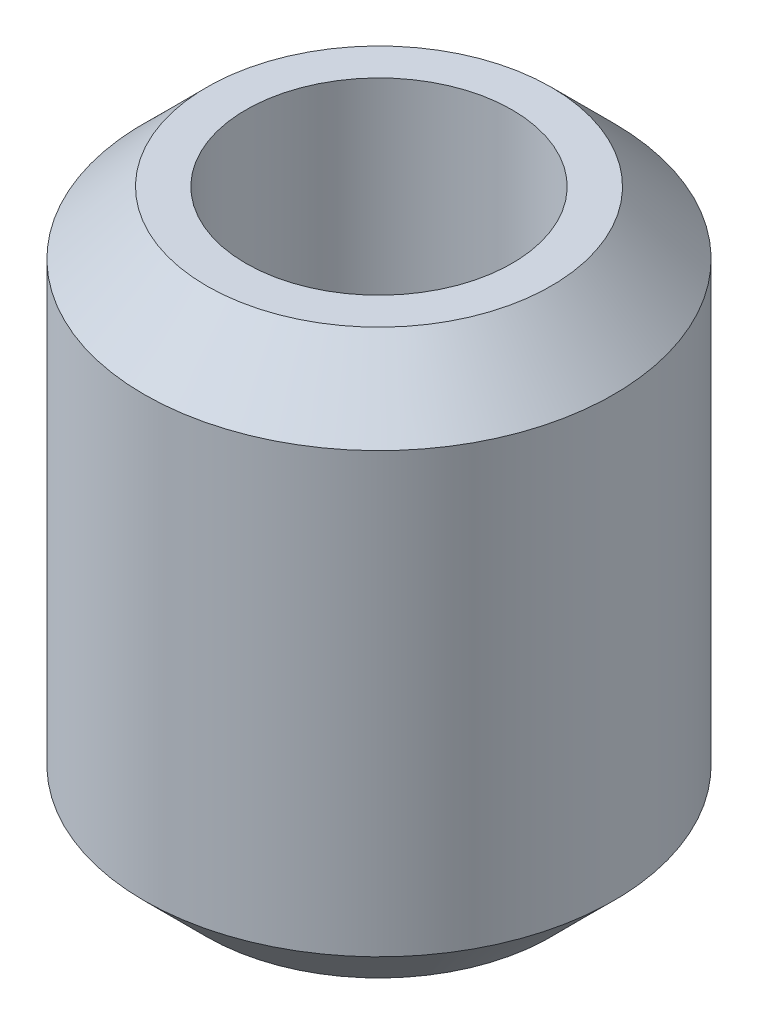
ISO-10303-21;
HEADER;
FILE_DESCRIPTION(('STEP AP214'),'2;1');
FILE_NAME('part.step','',(''),(''),'','','');
FILE_SCHEMA(('AUTOMOTIVE_DESIGN { 1 0 10303 214 1 1 1 1 }'));
ENDSEC;
DATA;
#1=APPLICATION_CONTEXT('core data for automotive mechanical design processes');
#2=APPLICATION_PROTOCOL_DEFINITION('international standard','automotive_design',2000,#1);
#3=PRODUCT_CONTEXT('',#1,'mechanical');
#4=PRODUCT('Part','Part','',(#3));
#5=PRODUCT_RELATED_PRODUCT_CATEGORY('part','',(#4));
#6=PRODUCT_DEFINITION_FORMATION('','',#4);
#7=PRODUCT_DEFINITION_CONTEXT('part definition',#1,'design');
#8=PRODUCT_DEFINITION('design','',#6,#7);
#9=PRODUCT_DEFINITION_SHAPE('','',#8);
#10=(LENGTH_UNIT() NAMED_UNIT(*) SI_UNIT(.MILLI.,.METRE.));
#11=(NAMED_UNIT(*) PLANE_ANGLE_UNIT() SI_UNIT($,.RADIAN.));
#12=(NAMED_UNIT(*) SI_UNIT($,.STERADIAN.) SOLID_ANGLE_UNIT());
#13=UNCERTAINTY_MEASURE_WITH_UNIT(LENGTH_MEASURE(1.E-05),#10,'distance_accuracy_value','');
#14=(GEOMETRIC_REPRESENTATION_CONTEXT(3) GLOBAL_UNCERTAINTY_ASSIGNED_CONTEXT((#13)) GLOBAL_UNIT_ASSIGNED_CONTEXT((#10,
#11,#12)) REPRESENTATION_CONTEXT('',''));
#15=CARTESIAN_POINT('',(0.,0.,0.));
#16=DIRECTION('',(0.,0.,1.));
#17=DIRECTION('',(1.,0.,0.));
#18=AXIS2_PLACEMENT_3D('',#15,#16,#17);
#19=CARTESIAN_POINT('',(0.,18.,0.));
#20=DIRECTION('',(0.,1.,0.));
#21=DIRECTION('',(0.,0.,1.));
#22=AXIS2_PLACEMENT_3D('',#19,#20,#21);
#23=PLANE('',#22);
#24=CARTESIAN_POINT('',(0.,18.,0.));
#25=DIRECTION('',(0.,1.,0.));
#26=DIRECTION('',(0.,0.,1.));
#27=AXIS2_PLACEMENT_3D('',#24,#25,#26);
#28=CIRCLE('',#27,5.50000000000001);
#29=CARTESIAN_POINT('',(0.,18.,5.50000000000001));
#30=VERTEX_POINT('',#29);
#31=EDGE_CURVE('E48',#30,#30,#28,.T.);
#32=ORIENTED_EDGE('',*,*,#31,.T.);
#33=EDGE_LOOP('',(#32));
#34=FACE_BOUND('',#33,.T.);
#35=CARTESIAN_POINT('',(0.,18.,0.));
#36=DIRECTION('',(0.,1.,0.));
#37=DIRECTION('',(0.,0.,1.));
#38=AXIS2_PLACEMENT_3D('',#35,#36,#37);
#39=CIRCLE('',#38,4.25);
#40=CARTESIAN_POINT('',(0.,18.,4.25));
#41=VERTEX_POINT('',#40);
#42=EDGE_CURVE('E53',#41,#41,#39,.T.);
#43=ORIENTED_EDGE('',*,*,#42,.F.);
#44=EDGE_LOOP('',(#43));
#45=FACE_BOUND('',#44,.T.);
#46=ADVANCED_FACE('F33',(#34,#45),#23,.T.);
#47=CARTESIAN_POINT('',(0.,0.,0.));
#48=DIRECTION('',(0.,1.,0.));
#49=DIRECTION('',(0.,0.,1.));
#50=AXIS2_PLACEMENT_3D('',#47,#48,#49);
#51=PLANE('',#50);
#52=CARTESIAN_POINT('',(0.,0.,0.));
#53=DIRECTION('',(0.,1.,0.));
#54=DIRECTION('',(0.,0.,1.));
#55=AXIS2_PLACEMENT_3D('',#52,#53,#54);
#56=CIRCLE('',#55,5.5);
#57=CARTESIAN_POINT('',(0.,0.,5.5));
#58=VERTEX_POINT('',#57);
#59=EDGE_CURVE('E10',#58,#58,#56,.F.);
#60=ORIENTED_EDGE('',*,*,#59,.T.);
#61=EDGE_LOOP('',(#60));
#62=FACE_BOUND('',#61,.T.);
#63=CARTESIAN_POINT('',(0.,0.,0.));
#64=DIRECTION('',(0.,1.,0.));
#65=DIRECTION('',(0.,0.,1.));
#66=AXIS2_PLACEMENT_3D('',#63,#64,#65);
#67=CIRCLE('',#66,4.25);
#68=CARTESIAN_POINT('',(0.,0.,4.25));
#69=VERTEX_POINT('',#68);
#70=EDGE_CURVE('E54',#69,#69,#67,.T.);
#71=ORIENTED_EDGE('',*,*,#70,.T.);
#72=EDGE_LOOP('',(#71));
#73=FACE_BOUND('',#72,.T.);
#74=ADVANCED_FACE('F64',(#62,#73),#51,.F.);
#75=CARTESIAN_POINT('',(0.,18.,0.));
#76=DIRECTION('',(0.,-1.,0.));
#77=DIRECTION('',(0.,0.,-1.));
#78=AXIS2_PLACEMENT_3D('',#75,#76,#77);
#79=CYLINDRICAL_SURFACE('',#78,7.5);
#80=CARTESIAN_POINT('',(0.,16.,0.));
#81=DIRECTION('',(0.,1.,0.));
#82=DIRECTION('',(0.,0.,1.));
#83=AXIS2_PLACEMENT_3D('',#80,#81,#82);
#84=CIRCLE('',#83,7.5);
#85=CARTESIAN_POINT('',(0.,16.,7.5));
#86=VERTEX_POINT('',#85);
#87=EDGE_CURVE('E40',#86,#86,#84,.F.);
#88=ORIENTED_EDGE('',*,*,#87,.T.);
#89=EDGE_LOOP('',(#88));
#90=FACE_BOUND('',#89,.T.);
#91=CARTESIAN_POINT('',(0.,1.99999999999999,0.));
#92=DIRECTION('',(0.,1.,0.));
#93=DIRECTION('',(0.,0.,1.));
#94=AXIS2_PLACEMENT_3D('',#91,#92,#93);
#95=CIRCLE('',#94,7.5);
#96=CARTESIAN_POINT('',(0.,1.99999999999999,7.5));
#97=VERTEX_POINT('',#96);
#98=EDGE_CURVE('E44',#97,#97,#95,.T.);
#99=ORIENTED_EDGE('',*,*,#98,.T.);
#100=EDGE_LOOP('',(#99));
#101=FACE_BOUND('',#100,.T.);
#102=ADVANCED_FACE('F70',(#90,#101),#79,.T.);
#103=CARTESIAN_POINT('',(0.,18.,0.));
#104=DIRECTION('',(0.,-1.,0.));
#105=DIRECTION('',(0.,0.,-1.));
#106=AXIS2_PLACEMENT_3D('',#103,#104,#105);
#107=CYLINDRICAL_SURFACE('',#106,4.25);
#108=ORIENTED_EDGE('',*,*,#42,.T.);
#109=EDGE_LOOP('',(#108));
#110=FACE_BOUND('',#109,.T.);
#111=ORIENTED_EDGE('',*,*,#70,.F.);
#112=EDGE_LOOP('',(#111));
#113=FACE_BOUND('',#112,.T.);
#114=ADVANCED_FACE('F60',(#110,#113),#107,.F.);
#115=CARTESIAN_POINT('',(0.,18.,0.));
#116=DIRECTION('',(0.,-1.,0.));
#117=DIRECTION('',(0.,0.,-1.));
#118=AXIS2_PLACEMENT_3D('',#115,#116,#117);
#119=CONICAL_SURFACE('',#118,5.50000000000001,0.785398163397447);
#120=ORIENTED_EDGE('',*,*,#87,.F.);
#121=EDGE_LOOP('',(#120));
#122=FACE_BOUND('',#121,.T.);
#123=ORIENTED_EDGE('',*,*,#31,.F.);
#124=EDGE_LOOP('',(#123));
#125=FACE_BOUND('',#124,.T.);
#126=ADVANCED_FACE('F75',(#122,#125),#119,.T.);
#127=CARTESIAN_POINT('',(0.,1.99999999999999,0.));
#128=DIRECTION('',(0.,1.,0.));
#129=DIRECTION('',(0.,0.,1.));
#130=AXIS2_PLACEMENT_3D('',#127,#128,#129);
#131=CONICAL_SURFACE('',#130,7.5,0.78539816339745);
#132=ORIENTED_EDGE('',*,*,#59,.F.);
#133=EDGE_LOOP('',(#132));
#134=FACE_BOUND('',#133,.T.);
#135=ORIENTED_EDGE('',*,*,#98,.F.);
#136=EDGE_LOOP('',(#135));
#137=FACE_BOUND('',#136,.T.);
#138=ADVANCED_FACE('F35',(#134,#137),#131,.T.);
#139=CLOSED_SHELL('',(#46,#74,#102,#114,#126,#138));
#140=MANIFOLD_SOLID_BREP('B2',#139);
#141=ADVANCED_BREP_SHAPE_REPRESENTATION('',(#18,#140),#14);
#142=SHAPE_DEFINITION_REPRESENTATION(#9,#141);
ENDSEC;
END-ISO-10303-21;
